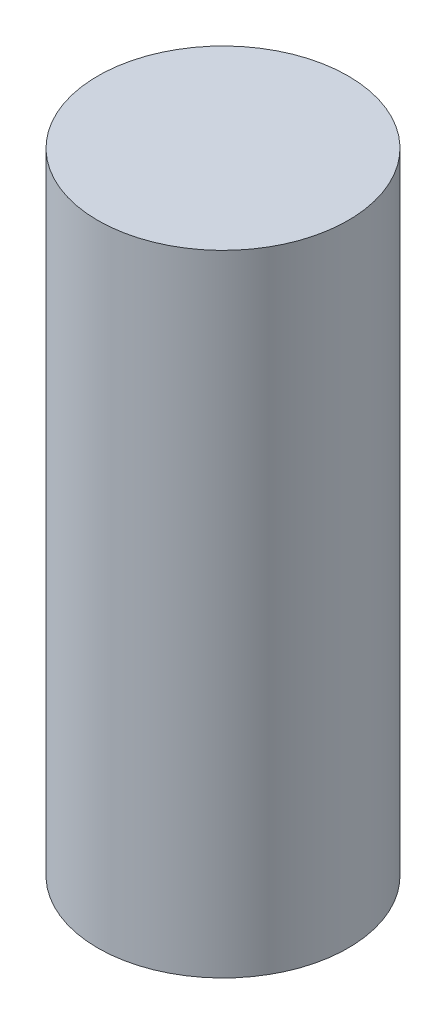
ISO-10303-21;
HEADER;
FILE_DESCRIPTION(('STEP AP214'),'2;1');
FILE_NAME('part.step','',(''),(''),'','','');
FILE_SCHEMA(('AUTOMOTIVE_DESIGN { 1 0 10303 214 1 1 1 1 }'));
ENDSEC;
DATA;
#1=APPLICATION_CONTEXT('core data for automotive mechanical design processes');
#2=APPLICATION_PROTOCOL_DEFINITION('international standard','automotive_design',2000,#1);
#3=PRODUCT_CONTEXT('',#1,'mechanical');
#4=PRODUCT('Part','Part','',(#3));
#5=PRODUCT_RELATED_PRODUCT_CATEGORY('part','',(#4));
#6=PRODUCT_DEFINITION_FORMATION('','',#4);
#7=PRODUCT_DEFINITION_CONTEXT('part definition',#1,'design');
#8=PRODUCT_DEFINITION('design','',#6,#7);
#9=PRODUCT_DEFINITION_SHAPE('','',#8);
#10=(LENGTH_UNIT() NAMED_UNIT(*) SI_UNIT(.MILLI.,.METRE.));
#11=(NAMED_UNIT(*) PLANE_ANGLE_UNIT() SI_UNIT($,.RADIAN.));
#12=(NAMED_UNIT(*) SI_UNIT($,.STERADIAN.) SOLID_ANGLE_UNIT());
#13=UNCERTAINTY_MEASURE_WITH_UNIT(LENGTH_MEASURE(1.E-05),#10,'distance_accuracy_value','');
#14=(GEOMETRIC_REPRESENTATION_CONTEXT(3) GLOBAL_UNCERTAINTY_ASSIGNED_CONTEXT((#13)) GLOBAL_UNIT_ASSIGNED_CONTEXT((#10,
#11,#12)) REPRESENTATION_CONTEXT('',''));
#15=CARTESIAN_POINT('',(0.,0.,0.));
#16=DIRECTION('',(0.,0.,1.));
#17=DIRECTION('',(1.,0.,0.));
#18=AXIS2_PLACEMENT_3D('',#15,#16,#17);
#19=CARTESIAN_POINT('',(0.,5.6,0.));
#20=DIRECTION('',(0.,-1.,0.));
#21=DIRECTION('',(0.,0.,-1.));
#22=AXIS2_PLACEMENT_3D('',#19,#20,#21);
#23=CYLINDRICAL_SURFACE('',#22,2.225);
#24=CARTESIAN_POINT('',(0.,5.6,0.));
#25=DIRECTION('',(0.,1.,0.));
#26=DIRECTION('',(0.,0.,1.));
#27=AXIS2_PLACEMENT_3D('',#24,#25,#26);
#28=CIRCLE('',#27,2.225);
#29=CARTESIAN_POINT('',(0.,5.6,2.225));
#30=VERTEX_POINT('',#29);
#31=EDGE_CURVE('E10',#30,#30,#28,.T.);
#32=ORIENTED_EDGE('',*,*,#31,.F.);
#33=EDGE_LOOP('',(#32));
#34=FACE_BOUND('',#33,.T.);
#35=CARTESIAN_POINT('',(0.,-5.6,0.));
#36=DIRECTION('',(0.,1.,0.));
#37=DIRECTION('',(0.,0.,1.));
#38=AXIS2_PLACEMENT_3D('',#35,#36,#37);
#39=CIRCLE('',#38,2.225);
#40=CARTESIAN_POINT('',(0.,-5.6,2.225));
#41=VERTEX_POINT('',#40);
#42=EDGE_CURVE('E40',#41,#41,#39,.T.);
#43=ORIENTED_EDGE('',*,*,#42,.T.);
#44=EDGE_LOOP('',(#43));
#45=FACE_BOUND('',#44,.T.);
#46=ADVANCED_FACE('F37',(#34,#45),#23,.T.);
#47=CARTESIAN_POINT('',(0.,5.6,0.));
#48=DIRECTION('',(0.,1.,0.));
#49=DIRECTION('',(0.,0.,1.));
#50=AXIS2_PLACEMENT_3D('',#47,#48,#49);
#51=PLANE('',#50);
#52=ORIENTED_EDGE('',*,*,#31,.T.);
#53=EDGE_LOOP('',(#52));
#54=FACE_BOUND('',#53,.T.);
#55=ADVANCED_FACE('F54',(#54),#51,.T.);
#56=CARTESIAN_POINT('',(0.,-5.6,0.));
#57=DIRECTION('',(0.,1.,0.));
#58=DIRECTION('',(0.,0.,1.));
#59=AXIS2_PLACEMENT_3D('',#56,#57,#58);
#60=PLANE('',#59);
#61=ORIENTED_EDGE('',*,*,#42,.F.);
#62=EDGE_LOOP('',(#61));
#63=FACE_BOUND('',#62,.T.);
#64=ADVANCED_FACE('F52',(#63),#60,.F.);
#65=CLOSED_SHELL('',(#46,#55,#64));
#66=MANIFOLD_SOLID_BREP('B2',#65);
#67=ADVANCED_BREP_SHAPE_REPRESENTATION('',(#18,#66),#14);
#68=SHAPE_DEFINITION_REPRESENTATION(#9,#67);
ENDSEC;
END-ISO-10303-21;
